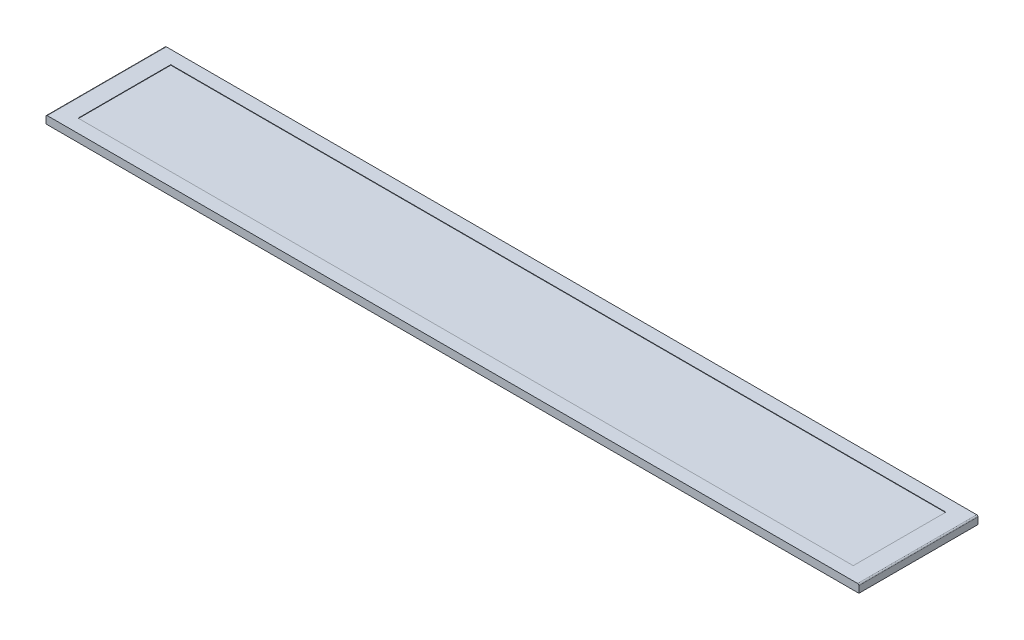
ISO-10303-21;
HEADER;
FILE_DESCRIPTION(('STEP AP214'),'2;1');
FILE_NAME('part.step','',(''),(''),'','','');
FILE_SCHEMA(('AUTOMOTIVE_DESIGN { 1 0 10303 214 1 1 1 1 }'));
ENDSEC;
DATA;
#1=APPLICATION_CONTEXT('core data for automotive mechanical design processes');
#2=APPLICATION_PROTOCOL_DEFINITION('international standard','automotive_design',2000,#1);
#3=PRODUCT_CONTEXT('',#1,'mechanical');
#4=PRODUCT('Part','Part','',(#3));
#5=PRODUCT_RELATED_PRODUCT_CATEGORY('part','',(#4));
#6=PRODUCT_DEFINITION_FORMATION('','',#4);
#7=PRODUCT_DEFINITION_CONTEXT('part definition',#1,'design');
#8=PRODUCT_DEFINITION('design','',#6,#7);
#9=PRODUCT_DEFINITION_SHAPE('','',#8);
#10=(LENGTH_UNIT() NAMED_UNIT(*) SI_UNIT(.MILLI.,.METRE.));
#11=(NAMED_UNIT(*) PLANE_ANGLE_UNIT() SI_UNIT($,.RADIAN.));
#12=(NAMED_UNIT(*) SI_UNIT($,.STERADIAN.) SOLID_ANGLE_UNIT());
#13=UNCERTAINTY_MEASURE_WITH_UNIT(LENGTH_MEASURE(1.E-05),#10,'distance_accuracy_value','');
#14=(GEOMETRIC_REPRESENTATION_CONTEXT(3) GLOBAL_UNCERTAINTY_ASSIGNED_CONTEXT((#13)) GLOBAL_UNIT_ASSIGNED_CONTEXT((#10,
#11,#12)) REPRESENTATION_CONTEXT('',''));
#15=CARTESIAN_POINT('',(0.,0.,0.));
#16=DIRECTION('',(0.,0.,1.));
#17=DIRECTION('',(1.,0.,0.));
#18=AXIS2_PLACEMENT_3D('',#15,#16,#17);
#19=CARTESIAN_POINT('',(91.863338954032,-65.5000000000031,-13.5));
#20=DIRECTION('',(0.,1.,0.));
#21=DIRECTION('',(0.,0.,1.));
#22=AXIS2_PLACEMENT_3D('',#19,#20,#21);
#23=PLANE('',#22);
#24=DIRECTION('',(-1.,0.,0.));
#25=VECTOR('',#24,1.);
#26=CARTESIAN_POINT('',(91.863338954032,-65.5000000000031,13.5));
#27=LINE('',#26,#25);
#28=CARTESIAN_POINT('',(91.863338954032,-65.5000000000031,13.5));
#29=VERTEX_POINT('',#28);
#30=CARTESIAN_POINT('',(-91.8635812822268,-65.4999999999999,13.5));
#31=VERTEX_POINT('',#30);
#32=EDGE_CURVE('E42',#29,#31,#27,.T.);
#33=ORIENTED_EDGE('',*,*,#32,.F.);
#34=DIRECTION('',(0.,0.,1.));
#35=VECTOR('',#34,1.);
#36=CARTESIAN_POINT('',(91.863338954032,-65.5000000000031,-13.5));
#37=LINE('',#36,#35);
#38=CARTESIAN_POINT('',(91.863338954032,-65.5000000000031,-13.5));
#39=VERTEX_POINT('',#38);
#40=EDGE_CURVE('E141',#39,#29,#37,.T.);
#41=ORIENTED_EDGE('',*,*,#40,.F.);
#42=DIRECTION('',(-1.,0.,0.));
#43=VECTOR('',#42,1.);
#44=CARTESIAN_POINT('',(91.863338954032,-65.5000000000031,-13.5));
#45=LINE('',#44,#43);
#46=CARTESIAN_POINT('',(-91.8635812822268,-65.4999999999999,-13.5));
#47=VERTEX_POINT('',#46);
#48=EDGE_CURVE('E11',#39,#47,#45,.T.);
#49=ORIENTED_EDGE('',*,*,#48,.T.);
#50=DIRECTION('',(0.,0.,1.));
#51=VECTOR('',#50,1.);
#52=CARTESIAN_POINT('',(-91.8635812822268,-65.4999999999999,-13.5));
#53=LINE('',#52,#51);
#54=EDGE_CURVE('E28',#47,#31,#53,.T.);
#55=ORIENTED_EDGE('',*,*,#54,.T.);
#56=EDGE_LOOP('',(#33,#41,#49,#55));
#57=FACE_BOUND('',#56,.T.);
#58=DIRECTION('',(1.,0.,0.));
#59=VECTOR('',#58,1.);
#60=CARTESIAN_POINT('',(-87.8635812963776,-65.4999999999999,-10.5));
#61=LINE('',#60,#59);
#62=CARTESIAN_POINT('',(-87.8635812963776,-65.4999999999999,-10.5));
#63=VERTEX_POINT('',#62);
#64=CARTESIAN_POINT('',(87.8633389398809,-65.500000000003,-10.5));
#65=VERTEX_POINT('',#64);
#66=EDGE_CURVE('E177',#63,#65,#61,.T.);
#67=ORIENTED_EDGE('',*,*,#66,.T.);
#68=DIRECTION('',(0.,0.,1.));
#69=VECTOR('',#68,1.);
#70=CARTESIAN_POINT('',(87.8633389398809,-65.500000000003,-10.5));
#71=LINE('',#70,#69);
#72=CARTESIAN_POINT('',(87.8633389398809,-65.500000000003,10.5));
#73=VERTEX_POINT('',#72);
#74=EDGE_CURVE('E161',#65,#73,#71,.T.);
#75=ORIENTED_EDGE('',*,*,#74,.T.);
#76=DIRECTION('',(-1.,0.,0.));
#77=VECTOR('',#76,1.);
#78=CARTESIAN_POINT('',(87.8633389398809,-65.500000000003,10.5));
#79=LINE('',#78,#77);
#80=CARTESIAN_POINT('',(-87.8635812963776,-65.4999999999999,10.5));
#81=VERTEX_POINT('',#80);
#82=EDGE_CURVE('E104',#73,#81,#79,.T.);
#83=ORIENTED_EDGE('',*,*,#82,.T.);
#84=DIRECTION('',(0.,0.,-1.));
#85=VECTOR('',#84,1.);
#86=CARTESIAN_POINT('',(-87.8635812963776,-65.4999999999999,10.5));
#87=LINE('',#86,#85);
#88=EDGE_CURVE('E162',#81,#63,#87,.T.);
#89=ORIENTED_EDGE('',*,*,#88,.T.);
#90=EDGE_LOOP('',(#67,#75,#83,#89));
#91=FACE_BOUND('',#90,.T.);
#92=ADVANCED_FACE('F17',(#57,#91),#23,.T.);
#93=CARTESIAN_POINT('',(-91.8635812822276,-65.4999999999991,-14.85));
#94=CARTESIAN_POINT('',(-91.8635812822276,-65.4999999999991,14.85));
#95=CARTESIAN_POINT('',(-91.9396360230349,-65.5001410103257,-14.85));
#96=CARTESIAN_POINT('',(-91.9396360230349,-65.5001410103257,14.85));
#97=CARTESIAN_POINT('',(-92.0139079736634,-65.5308466776204,-14.85));
#98=CARTESIAN_POINT('',(-92.0139079736634,-65.5308466776204,14.85));
#99=CARTESIAN_POINT('',(-92.1195301982066,-65.6361546468518,-14.85));
#100=CARTESIAN_POINT('',(-92.1195301982066,-65.6361546468518,14.85));
#101=CARTESIAN_POINT('',(-92.1499271633184,-65.7100493052987,-14.85));
#102=CARTESIAN_POINT('',(-92.1499271633184,-65.7100493052987,14.85));
#103=CARTESIAN_POINT('',(-92.1500092277248,-65.7866518182139,-14.85));
#104=CARTESIAN_POINT('',(-92.1500092277248,-65.7866518182139,14.85));
#105=(BOUNDED_SURFACE() B_SPLINE_SURFACE(3,1,((#93,#94),(#95,#96),(#97,#98),(#99,#100),(#101,
#102),(#103,#104)),.UNSPECIFIED.,.F.,.F.,.F.) B_SPLINE_SURFACE_WITH_KNOTS((4,2,4),(2,2),
(0.000488954966214881,0.5,1.),(0.,0.0297),
.UNSPECIFIED.) GEOMETRIC_REPRESENTATION_ITEM() RATIONAL_B_SPLINE_SURFACE(((1.,1.),(1.,1.),(1.,
1.),(1.,1.),(1.,1.),(1.,1.))) REPRESENTATION_ITEM('') SURFACE());
#106=CARTESIAN_POINT('',(-91.8635812822276,-65.4999999999991,13.5));
#107=CARTESIAN_POINT('',(-91.9396360230349,-65.5001410103257,13.5));
#108=CARTESIAN_POINT('',(-92.0139079736634,-65.5308466776204,13.5));
#109=CARTESIAN_POINT('',(-92.1195301982066,-65.6361546468518,13.5));
#110=CARTESIAN_POINT('',(-92.1499271633184,-65.7100493052987,13.5));
#111=CARTESIAN_POINT('',(-92.1500092277248,-65.7866518182139,13.5));
#112=(BOUNDED_CURVE() B_SPLINE_CURVE(3,(#106,#107,#108,#109,#110,#111),.UNSPECIFIED.,.F.,
.F.) B_SPLINE_CURVE_WITH_KNOTS((4,2,4),(0.000488954966214881,0.5,1.),
.UNSPECIFIED.) CURVE() GEOMETRIC_REPRESENTATION_ITEM() RATIONAL_B_SPLINE_CURVE((1.,1.,1.,1.,1.,1.)) REPRESENTATION_ITEM(''));
#113=CARTESIAN_POINT('',(-92.1500092277248,-65.7866518182139,13.5));
#114=VERTEX_POINT('',#113);
#115=EDGE_CURVE('E158',#31,#114,#112,.T.);
#116=CARTESIAN_POINT('',(-91.8635812822276,-65.4999999999991,-13.5));
#117=CARTESIAN_POINT('',(-91.9396360230349,-65.5001410103257,-13.5));
#118=CARTESIAN_POINT('',(-92.0139079736634,-65.5308466776204,-13.5));
#119=CARTESIAN_POINT('',(-92.1195301982066,-65.6361546468518,-13.5));
#120=CARTESIAN_POINT('',(-92.1499271633184,-65.7100493052987,-13.5));
#121=CARTESIAN_POINT('',(-92.1500092277248,-65.7866518182139,-13.5));
#122=(BOUNDED_CURVE() B_SPLINE_CURVE(3,(#116,#117,#118,#119,#120,#121),.UNSPECIFIED.,.F.,
.F.) B_SPLINE_CURVE_WITH_KNOTS((4,2,4),(0.000488954966214881,0.5,1.),
.UNSPECIFIED.) CURVE() GEOMETRIC_REPRESENTATION_ITEM() RATIONAL_B_SPLINE_CURVE((1.,1.,1.,1.,1.,1.)) REPRESENTATION_ITEM(''));
#123=CARTESIAN_POINT('',(-92.1500092277248,-65.7866518182139,-13.5));
#124=VERTEX_POINT('',#123);
#125=EDGE_CURVE('E167',#47,#124,#122,.T.);
#126=DIRECTION('',(0.,0.,1.));
#127=VECTOR('',#126,1.);
#128=CARTESIAN_POINT('',(-92.1500092277248,-65.7866518182139,-13.5));
#129=LINE('',#128,#127);
#130=EDGE_CURVE('E140',#124,#114,#129,.T.);
#131=ORIENTED_EDGE('',*,*,#115,.F.);
#132=ORIENTED_EDGE('',*,*,#54,.F.);
#133=ORIENTED_EDGE('',*,*,#125,.T.);
#134=ORIENTED_EDGE('',*,*,#130,.T.);
#135=EDGE_LOOP('',(#131,#132,#133,#134));
#136=FACE_BOUND('',#135,.T.);
#137=ADVANCED_FACE('F284',(#136),#105,.T.);
#138=CARTESIAN_POINT('',(92.1499907722462,-65.786427945501,-14.85));
#139=CARTESIAN_POINT('',(92.1499907722462,-65.786427945501,14.85));
#140=CARTESIAN_POINT('',(92.1498497619233,-65.7103732047029,-14.85));
#141=CARTESIAN_POINT('',(92.1498497619233,-65.7103732047029,14.85));
#142=CARTESIAN_POINT('',(92.1191440946308,-65.6361012540719,-14.85));
#143=CARTESIAN_POINT('',(92.1191440946308,-65.6361012540719,14.85));
#144=CARTESIAN_POINT('',(92.0138361253869,-65.5304790295133,-14.85));
#145=CARTESIAN_POINT('',(92.0138361253869,-65.5304790295133,14.85));
#146=CARTESIAN_POINT('',(91.9399414669522,-65.5000820644061,-14.85));
#147=CARTESIAN_POINT('',(91.9399414669522,-65.5000820644061,14.85));
#148=CARTESIAN_POINT('',(91.863338954032,-65.5000000000031,-14.85));
#149=CARTESIAN_POINT('',(91.863338954032,-65.5000000000031,14.85));
#150=(BOUNDED_SURFACE() B_SPLINE_SURFACE(3,1,((#138,#139),(#140,#141),(#142,#143),(#144,#145),
(#146,#147),(#148,#149)),.UNSPECIFIED.,.F.,.F.,.F.) B_SPLINE_SURFACE_WITH_KNOTS((4,2,4),(2,2),
(0.000488954953983696,0.5,1.),(0.,0.0297),
.UNSPECIFIED.) GEOMETRIC_REPRESENTATION_ITEM() RATIONAL_B_SPLINE_SURFACE(((1.,1.),(1.,1.),(1.,
1.),(1.,1.),(1.,1.),(1.,1.))) REPRESENTATION_ITEM('') SURFACE());
#151=CARTESIAN_POINT('',(92.1499907722462,-65.786427945501,13.5));
#152=CARTESIAN_POINT('',(92.1498497619233,-65.7103732047029,13.5));
#153=CARTESIAN_POINT('',(92.1191440946308,-65.6361012540719,13.5));
#154=CARTESIAN_POINT('',(92.0138361253869,-65.5304790295133,13.5));
#155=CARTESIAN_POINT('',(91.9399414669522,-65.5000820644061,13.5));
#156=CARTESIAN_POINT('',(91.863338954032,-65.5000000000031,13.5));
#157=(BOUNDED_CURVE() B_SPLINE_CURVE(3,(#151,#152,#153,#154,#155,#156),.UNSPECIFIED.,.F.,
.F.) B_SPLINE_CURVE_WITH_KNOTS((4,2,4),(0.000488954953983696,0.5,1.),
.UNSPECIFIED.) CURVE() GEOMETRIC_REPRESENTATION_ITEM() RATIONAL_B_SPLINE_CURVE((1.,1.,1.,1.,1.,1.)) REPRESENTATION_ITEM(''));
#158=CARTESIAN_POINT('',(92.1499907722462,-65.786427945501,13.5));
#159=VERTEX_POINT('',#158);
#160=EDGE_CURVE('E133',#159,#29,#157,.T.);
#161=DIRECTION('',(0.,0.,1.));
#162=VECTOR('',#161,1.);
#163=CARTESIAN_POINT('',(92.1499907722462,-65.786427945501,-13.5));
#164=LINE('',#163,#162);
#165=CARTESIAN_POINT('',(92.1499907722462,-65.786427945501,-13.5));
#166=VERTEX_POINT('',#165);
#167=EDGE_CURVE('E165',#166,#159,#164,.T.);
#168=CARTESIAN_POINT('',(92.1499907722462,-65.786427945501,-13.5));
#169=CARTESIAN_POINT('',(92.1498497619233,-65.7103732047029,-13.5));
#170=CARTESIAN_POINT('',(92.1191440946308,-65.6361012540719,-13.5));
#171=CARTESIAN_POINT('',(92.0138361253869,-65.5304790295133,-13.5));
#172=CARTESIAN_POINT('',(91.9399414669522,-65.5000820644061,-13.5));
#173=CARTESIAN_POINT('',(91.863338954032,-65.5000000000031,-13.5));
#174=(BOUNDED_CURVE() B_SPLINE_CURVE(3,(#168,#169,#170,#171,#172,#173),.UNSPECIFIED.,.F.,
.F.) B_SPLINE_CURVE_WITH_KNOTS((4,2,4),(0.000488954953983696,0.5,1.),
.UNSPECIFIED.) CURVE() GEOMETRIC_REPRESENTATION_ITEM() RATIONAL_B_SPLINE_CURVE((1.,1.,1.,1.,1.,1.)) REPRESENTATION_ITEM(''));
#175=EDGE_CURVE('E134',#166,#39,#174,.T.);
#176=ORIENTED_EDGE('',*,*,#160,.F.);
#177=ORIENTED_EDGE('',*,*,#167,.F.);
#178=ORIENTED_EDGE('',*,*,#175,.T.);
#179=ORIENTED_EDGE('',*,*,#40,.T.);
#180=EDGE_LOOP('',(#176,#177,#178,#179));
#181=FACE_BOUND('',#180,.T.);
#182=ADVANCED_FACE('F272',(#181),#150,.T.);
#183=CARTESIAN_POINT('',(-92.0667707396149,-65.5835521934934,-13.5));
#184=DIRECTION('',(0.,0.,-1.));
#185=DIRECTION('',(1.,0.,0.));
#186=AXIS2_PLACEMENT_3D('',#183,#184,#185);
#187=PLANE('',#186);
#188=ORIENTED_EDGE('',*,*,#125,.F.);
#189=ORIENTED_EDGE('',*,*,#48,.F.);
#190=ORIENTED_EDGE('',*,*,#175,.F.);
#191=DIRECTION('',(-1.3771917196021E-07,1.,0.));
#192=VECTOR('',#191,1.);
#193=CARTESIAN_POINT('',(92.1499909793887,-67.2905209843088,-13.5));
#194=LINE('',#193,#192);
#195=CARTESIAN_POINT('',(92.1499909793887,-67.2905209843088,-13.5));
#196=VERTEX_POINT('',#195);
#197=EDGE_CURVE('E197',#196,#166,#194,.T.);
#198=ORIENTED_EDGE('',*,*,#197,.F.);
#199=DIRECTION('',(1.,9.78264049133197E-08,0.));
#200=VECTOR('',#199,1.);
#201=CARTESIAN_POINT('',(-92.1500090206108,-67.2905390137152,-13.5));
#202=LINE('',#201,#200);
#203=CARTESIAN_POINT('',(-92.1500090206108,-67.2905390137152,-13.5));
#204=VERTEX_POINT('',#203);
#205=EDGE_CURVE('E149',#204,#196,#202,.T.);
#206=ORIENTED_EDGE('',*,*,#205,.F.);
#207=DIRECTION('',(1.37719182388299E-07,-1.,0.));
#208=VECTOR('',#207,1.);
#209=CARTESIAN_POINT('',(-92.1500092277248,-65.7866518182139,-13.5));
#210=LINE('',#209,#208);
#211=EDGE_CURVE('E150',#124,#204,#210,.T.);
#212=ORIENTED_EDGE('',*,*,#211,.F.);
#213=EDGE_LOOP('',(#188,#189,#190,#198,#206,#212));
#214=FACE_BOUND('',#213,.T.);
#215=ADVANCED_FACE('F287',(#214),#187,.T.);
#216=CARTESIAN_POINT('',(92.1499909793887,-67.2905209843088,-13.5));
#217=DIRECTION('',(1.,1.37719183032235E-07,0.));
#218=DIRECTION('',(0.,0.,1.));
#219=AXIS2_PLACEMENT_3D('',#216,#217,#218);
#220=PLANE('',#219);
#221=DIRECTION('',(-1.3771917196021E-07,1.,0.));
#222=VECTOR('',#221,1.);
#223=CARTESIAN_POINT('',(92.1499909793887,-67.2905209843088,13.5));
#224=LINE('',#223,#222);
#225=CARTESIAN_POINT('',(92.1499909793887,-67.2905209843088,13.5));
#226=VERTEX_POINT('',#225);
#227=EDGE_CURVE('E128',#226,#159,#224,.T.);
#228=ORIENTED_EDGE('',*,*,#227,.F.);
#229=DIRECTION('',(0.,0.,1.));
#230=VECTOR('',#229,1.);
#231=CARTESIAN_POINT('',(92.1499909793887,-67.2905209843088,-13.5));
#232=LINE('',#231,#230);
#233=EDGE_CURVE('E142',#196,#226,#232,.T.);
#234=ORIENTED_EDGE('',*,*,#233,.F.);
#235=ORIENTED_EDGE('',*,*,#197,.T.);
#236=ORIENTED_EDGE('',*,*,#167,.T.);
#237=EDGE_LOOP('',(#228,#234,#235,#236));
#238=FACE_BOUND('',#237,.T.);
#239=ADVANCED_FACE('F275',(#238),#220,.T.);
#240=CARTESIAN_POINT('',(-92.1500090206108,-67.2905390137152,-13.5));
#241=DIRECTION('',(9.78264049042832E-08,-1.,0.));
#242=DIRECTION('',(0.,0.,1.));
#243=AXIS2_PLACEMENT_3D('',#240,#241,#242);
#244=PLANE('',#243);
#245=DIRECTION('',(1.,9.78264049133197E-08,0.));
#246=VECTOR('',#245,1.);
#247=CARTESIAN_POINT('',(-92.1500090206108,-67.2905390137152,13.5));
#248=LINE('',#247,#246);
#249=CARTESIAN_POINT('',(-92.1500090206108,-67.2905390137152,13.5));
#250=VERTEX_POINT('',#249);
#251=EDGE_CURVE('E132',#250,#226,#248,.T.);
#252=ORIENTED_EDGE('',*,*,#251,.F.);
#253=DIRECTION('',(0.,0.,1.));
#254=VECTOR('',#253,1.);
#255=CARTESIAN_POINT('',(-92.1500090206108,-67.2905390137152,-13.5));
#256=LINE('',#255,#254);
#257=EDGE_CURVE('E154',#204,#250,#256,.T.);
#258=ORIENTED_EDGE('',*,*,#257,.F.);
#259=ORIENTED_EDGE('',*,*,#205,.T.);
#260=ORIENTED_EDGE('',*,*,#233,.T.);
#261=EDGE_LOOP('',(#252,#258,#259,#260));
#262=FACE_BOUND('',#261,.T.);
#263=ADVANCED_FACE('F279',(#262),#244,.T.);
#264=CARTESIAN_POINT('',(-92.1500092277248,-65.7866518182139,-13.5));
#265=DIRECTION('',(-1.,-1.37719180542708E-07,0.));
#266=DIRECTION('',(0.,0.,-1.));
#267=AXIS2_PLACEMENT_3D('',#264,#265,#266);
#268=PLANE('',#267);
#269=DIRECTION('',(1.37719182388299E-07,-1.,0.));
#270=VECTOR('',#269,1.);
#271=CARTESIAN_POINT('',(-92.1500092277248,-65.7866518182139,13.5));
#272=LINE('',#271,#270);
#273=EDGE_CURVE('E193',#114,#250,#272,.T.);
#274=ORIENTED_EDGE('',*,*,#273,.F.);
#275=ORIENTED_EDGE('',*,*,#130,.F.);
#276=ORIENTED_EDGE('',*,*,#211,.T.);
#277=ORIENTED_EDGE('',*,*,#257,.T.);
#278=EDGE_LOOP('',(#274,#275,#276,#277));
#279=FACE_BOUND('',#278,.T.);
#280=ADVANCED_FACE('F280',(#279),#268,.T.);
#281=CARTESIAN_POINT('',(-92.0667707396149,-65.5835521934934,13.5));
#282=DIRECTION('',(0.,0.,-1.));
#283=DIRECTION('',(1.,0.,0.));
#284=AXIS2_PLACEMENT_3D('',#281,#282,#283);
#285=PLANE('',#284);
#286=ORIENTED_EDGE('',*,*,#115,.T.);
#287=ORIENTED_EDGE('',*,*,#273,.T.);
#288=ORIENTED_EDGE('',*,*,#251,.T.);
#289=ORIENTED_EDGE('',*,*,#227,.T.);
#290=ORIENTED_EDGE('',*,*,#160,.T.);
#291=ORIENTED_EDGE('',*,*,#32,.T.);
#292=EDGE_LOOP('',(#286,#287,#288,#289,#290,#291));
#293=FACE_BOUND('',#292,.T.);
#294=ADVANCED_FACE('F19',(#293),#285,.F.);
#295=CARTESIAN_POINT('',(87.8633389398809,-65.600000000003,-10.5));
#296=DIRECTION('',(-1.,0.,0.));
#297=DIRECTION('',(0.,0.,-1.));
#298=AXIS2_PLACEMENT_3D('',#295,#296,#297);
#299=PLANE('',#298);
#300=ORIENTED_EDGE('',*,*,#74,.F.);
#301=DIRECTION('',(0.,1.,0.));
#302=VECTOR('',#301,1.);
#303=CARTESIAN_POINT('',(87.8633389398809,-65.600000000003,-10.5));
#304=LINE('',#303,#302);
#305=CARTESIAN_POINT('',(87.8633389398809,-65.600000000003,-10.5));
#306=VERTEX_POINT('',#305);
#307=EDGE_CURVE('E113',#306,#65,#304,.T.);
#308=ORIENTED_EDGE('',*,*,#307,.F.);
#309=DIRECTION('',(0.,0.,1.));
#310=VECTOR('',#309,1.);
#311=CARTESIAN_POINT('',(87.8633389398809,-65.600000000003,-10.5));
#312=LINE('',#311,#310);
#313=CARTESIAN_POINT('',(87.8633389398809,-65.600000000003,10.5));
#314=VERTEX_POINT('',#313);
#315=EDGE_CURVE('E108',#306,#314,#312,.T.);
#316=ORIENTED_EDGE('',*,*,#315,.T.);
#317=DIRECTION('',(0.,1.,0.));
#318=VECTOR('',#317,1.);
#319=CARTESIAN_POINT('',(87.8633389398809,-65.600000000003,10.5));
#320=LINE('',#319,#318);
#321=EDGE_CURVE('E96',#314,#73,#320,.T.);
#322=ORIENTED_EDGE('',*,*,#321,.T.);
#323=EDGE_LOOP('',(#300,#308,#316,#322));
#324=FACE_BOUND('',#323,.T.);
#325=ADVANCED_FACE('F111',(#324),#299,.T.);
#326=CARTESIAN_POINT('',(87.8633389398809,-65.600000000003,10.5));
#327=DIRECTION('',(0.,0.,-1.));
#328=DIRECTION('',(1.,0.,0.));
#329=AXIS2_PLACEMENT_3D('',#326,#327,#328);
#330=PLANE('',#329);
#331=ORIENTED_EDGE('',*,*,#82,.F.);
#332=ORIENTED_EDGE('',*,*,#321,.F.);
#333=DIRECTION('',(-1.,0.,0.));
#334=VECTOR('',#333,1.);
#335=CARTESIAN_POINT('',(87.8633389398809,-65.600000000003,10.5));
#336=LINE('',#335,#334);
#337=CARTESIAN_POINT('',(-87.8635812963776,-65.5999999999999,10.5));
#338=VERTEX_POINT('',#337);
#339=EDGE_CURVE('E101',#314,#338,#336,.T.);
#340=ORIENTED_EDGE('',*,*,#339,.T.);
#341=DIRECTION('',(0.,1.,0.));
#342=VECTOR('',#341,1.);
#343=CARTESIAN_POINT('',(-87.8635812963776,-65.5999999999999,10.5));
#344=LINE('',#343,#342);
#345=EDGE_CURVE('E21',#338,#81,#344,.T.);
#346=ORIENTED_EDGE('',*,*,#345,.T.);
#347=EDGE_LOOP('',(#331,#332,#340,#346));
#348=FACE_BOUND('',#347,.T.);
#349=ADVANCED_FACE('F98',(#348),#330,.T.);
#350=CARTESIAN_POINT('',(-87.8635812963776,-65.5999999999999,10.5));
#351=DIRECTION('',(1.,0.,0.));
#352=DIRECTION('',(0.,-1.,0.));
#353=AXIS2_PLACEMENT_3D('',#350,#351,#352);
#354=PLANE('',#353);
#355=ORIENTED_EDGE('',*,*,#88,.F.);
#356=ORIENTED_EDGE('',*,*,#345,.F.);
#357=DIRECTION('',(0.,0.,-1.));
#358=VECTOR('',#357,1.);
#359=CARTESIAN_POINT('',(-87.8635812963776,-65.5999999999999,10.5));
#360=LINE('',#359,#358);
#361=CARTESIAN_POINT('',(-87.8635812963776,-65.5999999999999,-10.5));
#362=VERTEX_POINT('',#361);
#363=EDGE_CURVE('E121',#338,#362,#360,.T.);
#364=ORIENTED_EDGE('',*,*,#363,.T.);
#365=DIRECTION('',(0.,1.,0.));
#366=VECTOR('',#365,1.);
#367=CARTESIAN_POINT('',(-87.8635812963776,-65.5999999999999,-10.5));
#368=LINE('',#367,#366);
#369=EDGE_CURVE('E182',#362,#63,#368,.T.);
#370=ORIENTED_EDGE('',*,*,#369,.T.);
#371=EDGE_LOOP('',(#355,#356,#364,#370));
#372=FACE_BOUND('',#371,.T.);
#373=ADVANCED_FACE('F237',(#372),#354,.T.);
#374=CARTESIAN_POINT('',(-87.8635812963776,-65.5999999999999,-10.5));
#375=DIRECTION('',(0.,0.,1.));
#376=DIRECTION('',(0.,1.,0.));
#377=AXIS2_PLACEMENT_3D('',#374,#375,#376);
#378=PLANE('',#377);
#379=ORIENTED_EDGE('',*,*,#66,.F.);
#380=ORIENTED_EDGE('',*,*,#369,.F.);
#381=DIRECTION('',(1.,0.,0.));
#382=VECTOR('',#381,1.);
#383=CARTESIAN_POINT('',(-87.8635812963776,-65.5999999999999,-10.5));
#384=LINE('',#383,#382);
#385=EDGE_CURVE('E179',#362,#306,#384,.T.);
#386=ORIENTED_EDGE('',*,*,#385,.T.);
#387=ORIENTED_EDGE('',*,*,#307,.T.);
#388=EDGE_LOOP('',(#379,#380,#386,#387));
#389=FACE_BOUND('',#388,.T.);
#390=ADVANCED_FACE('F241',(#389),#378,.T.);
#391=CARTESIAN_POINT('',(87.8633389398809,-65.600000000003,-10.5));
#392=DIRECTION('',(0.,1.,0.));
#393=DIRECTION('',(0.,0.,1.));
#394=AXIS2_PLACEMENT_3D('',#391,#392,#393);
#395=PLANE('',#394);
#396=ORIENTED_EDGE('',*,*,#315,.F.);
#397=ORIENTED_EDGE('',*,*,#385,.F.);
#398=ORIENTED_EDGE('',*,*,#363,.F.);
#399=ORIENTED_EDGE('',*,*,#339,.F.);
#400=EDGE_LOOP('',(#396,#397,#398,#399));
#401=FACE_BOUND('',#400,.T.);
#402=ADVANCED_FACE('F119',(#401),#395,.T.);
#403=CLOSED_SHELL('',(#92,#137,#182,#215,#239,#263,#280,#294,#325,#349,#373,#390,#402));
#404=MANIFOLD_SOLID_BREP('B1',#403);
#405=ADVANCED_BREP_SHAPE_REPRESENTATION('',(#18,#404),#14);
#406=SHAPE_DEFINITION_REPRESENTATION(#9,#405);
ENDSEC;
END-ISO-10303-21;
